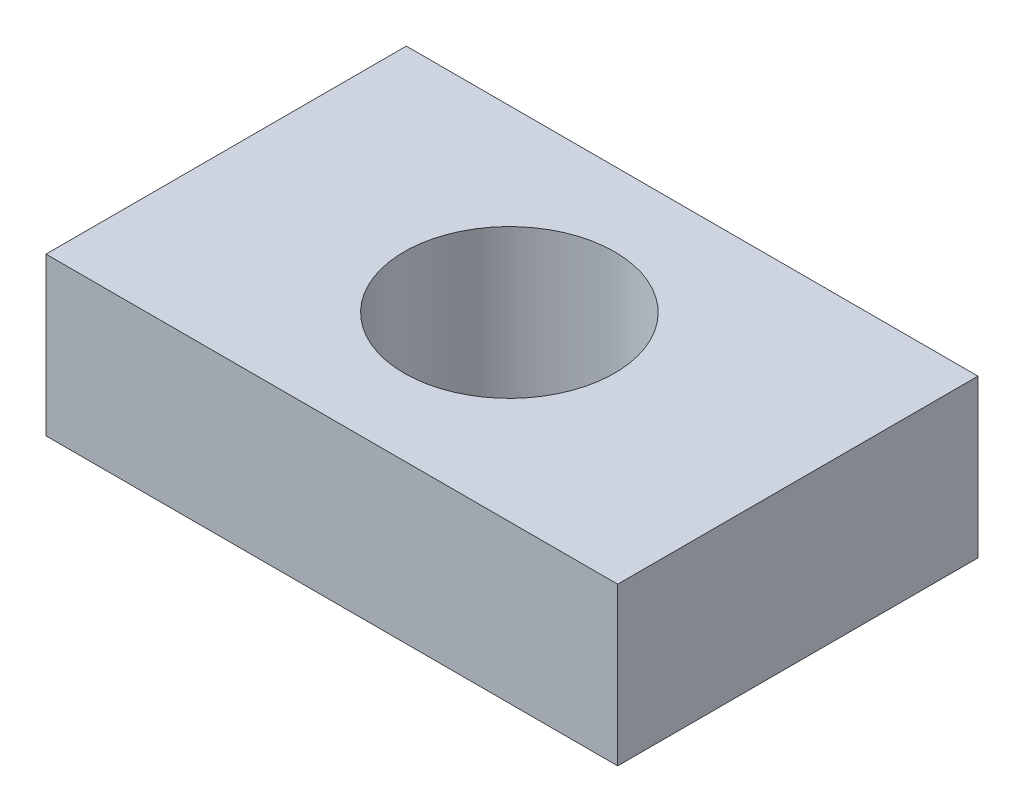
ISO-10303-21;
HEADER;
FILE_DESCRIPTION(('STEP AP214'),'2;1');
FILE_NAME('part.step','',(''),(''),'','','');
FILE_SCHEMA(('AUTOMOTIVE_DESIGN { 1 0 10303 214 1 1 1 1 }'));
ENDSEC;
DATA;
#1=APPLICATION_CONTEXT('core data for automotive mechanical design processes');
#2=APPLICATION_PROTOCOL_DEFINITION('international standard','automotive_design',2000,#1);
#3=PRODUCT_CONTEXT('',#1,'mechanical');
#4=PRODUCT('Part','Part','',(#3));
#5=PRODUCT_RELATED_PRODUCT_CATEGORY('part','',(#4));
#6=PRODUCT_DEFINITION_FORMATION('','',#4);
#7=PRODUCT_DEFINITION_CONTEXT('part definition',#1,'design');
#8=PRODUCT_DEFINITION('design','',#6,#7);
#9=PRODUCT_DEFINITION_SHAPE('','',#8);
#10=(LENGTH_UNIT() NAMED_UNIT(*) SI_UNIT(.MILLI.,.METRE.));
#11=(NAMED_UNIT(*) PLANE_ANGLE_UNIT() SI_UNIT($,.RADIAN.));
#12=(NAMED_UNIT(*) SI_UNIT($,.STERADIAN.) SOLID_ANGLE_UNIT());
#13=UNCERTAINTY_MEASURE_WITH_UNIT(LENGTH_MEASURE(1.E-05),#10,'distance_accuracy_value','');
#14=(GEOMETRIC_REPRESENTATION_CONTEXT(3) GLOBAL_UNCERTAINTY_ASSIGNED_CONTEXT((#13)) GLOBAL_UNIT_ASSIGNED_CONTEXT((#10,
#11,#12)) REPRESENTATION_CONTEXT('',''));
#15=CARTESIAN_POINT('',(0.,0.,0.));
#16=DIRECTION('',(0.,0.,1.));
#17=DIRECTION('',(1.,0.,0.));
#18=AXIS2_PLACEMENT_3D('',#15,#16,#17);
#19=CARTESIAN_POINT('',(0.,43.,0.));
#20=DIRECTION('',(0.,1.,0.));
#21=DIRECTION('',(0.,0.,1.));
#22=AXIS2_PLACEMENT_3D('',#19,#20,#21);
#23=PLANE('',#22);
#24=DIRECTION('',(0.,0.,1.));
#25=VECTOR('',#24,1.);
#26=CARTESIAN_POINT('',(-68.3698875309617,43.,-35.0871856830449));
#27=LINE('',#26,#25);
#28=CARTESIAN_POINT('',(-68.3698875309617,43.,-35.0871856830449));
#29=VERTEX_POINT('',#28);
#30=CARTESIAN_POINT('',(-68.3698875309617,43.,63.3574324333839));
#31=VERTEX_POINT('',#30);
#32=EDGE_CURVE('E98',#29,#31,#27,.T.);
#33=ORIENTED_EDGE('',*,*,#32,.T.);
#34=DIRECTION('',(1.,0.,0.));
#35=VECTOR('',#34,1.);
#36=CARTESIAN_POINT('',(-68.3698875309617,43.,63.3574324333839));
#37=LINE('',#36,#35);
#38=CARTESIAN_POINT('',(87.8182133095638,43.,63.3574324333839));
#39=VERTEX_POINT('',#38);
#40=EDGE_CURVE('E93',#31,#39,#37,.T.);
#41=ORIENTED_EDGE('',*,*,#40,.T.);
#42=DIRECTION('',(0.,0.,-1.));
#43=VECTOR('',#42,1.);
#44=CARTESIAN_POINT('',(87.8182133095638,43.,-35.0871856830449));
#45=LINE('',#44,#43);
#46=CARTESIAN_POINT('',(87.8182133095638,43.,-35.0871856830449));
#47=VERTEX_POINT('',#46);
#48=EDGE_CURVE('E96',#39,#47,#45,.T.);
#49=ORIENTED_EDGE('',*,*,#48,.T.);
#50=DIRECTION('',(-1.,0.,0.));
#51=VECTOR('',#50,1.);
#52=CARTESIAN_POINT('',(-68.3698875309617,43.,-35.0871856830449));
#53=LINE('',#52,#51);
#54=EDGE_CURVE('E63',#47,#29,#53,.T.);
#55=ORIENTED_EDGE('',*,*,#54,.T.);
#56=EDGE_LOOP('',(#33,#41,#49,#55));
#57=FACE_BOUND('',#56,.T.);
#58=CARTESIAN_POINT('',(8.7334995507907,43.,13.8634320657455));
#59=DIRECTION('',(0.,1.,0.));
#60=DIRECTION('',(0.,0.,1.));
#61=AXIS2_PLACEMENT_3D('',#58,#59,#60);
#62=CIRCLE('',#61,28.7473015616817);
#63=CARTESIAN_POINT('',(8.7334995507907,43.,42.6107336274272));
#64=VERTEX_POINT('',#63);
#65=EDGE_CURVE('E118',#64,#64,#62,.T.);
#66=ORIENTED_EDGE('',*,*,#65,.F.);
#67=EDGE_LOOP('',(#66));
#68=FACE_BOUND('',#67,.T.);
#69=ADVANCED_FACE('F45',(#57,#68),#23,.T.);
#70=CARTESIAN_POINT('',(0.,0.,0.));
#71=DIRECTION('',(0.,1.,0.));
#72=DIRECTION('',(0.,0.,1.));
#73=AXIS2_PLACEMENT_3D('',#70,#71,#72);
#74=PLANE('',#73);
#75=DIRECTION('',(0.,0.,1.));
#76=VECTOR('',#75,1.);
#77=CARTESIAN_POINT('',(-68.3698875309617,0.,-35.0871856830449));
#78=LINE('',#77,#76);
#79=CARTESIAN_POINT('',(-68.3698875309617,0.,-35.0871856830449));
#80=VERTEX_POINT('',#79);
#81=CARTESIAN_POINT('',(-68.3698875309617,0.,63.3574324333839));
#82=VERTEX_POINT('',#81);
#83=EDGE_CURVE('E114',#80,#82,#78,.T.);
#84=ORIENTED_EDGE('',*,*,#83,.F.);
#85=DIRECTION('',(-1.,0.,0.));
#86=VECTOR('',#85,1.);
#87=CARTESIAN_POINT('',(-68.3698875309617,0.,-35.0871856830449));
#88=LINE('',#87,#86);
#89=CARTESIAN_POINT('',(87.8182133095638,0.,-35.0871856830449));
#90=VERTEX_POINT('',#89);
#91=EDGE_CURVE('E86',#90,#80,#88,.T.);
#92=ORIENTED_EDGE('',*,*,#91,.F.);
#93=DIRECTION('',(0.,0.,-1.));
#94=VECTOR('',#93,1.);
#95=CARTESIAN_POINT('',(87.8182133095638,0.,-35.0871856830449));
#96=LINE('',#95,#94);
#97=CARTESIAN_POINT('',(87.8182133095638,0.,63.3574324333839));
#98=VERTEX_POINT('',#97);
#99=EDGE_CURVE('E80',#98,#90,#96,.T.);
#100=ORIENTED_EDGE('',*,*,#99,.F.);
#101=DIRECTION('',(1.,0.,0.));
#102=VECTOR('',#101,1.);
#103=CARTESIAN_POINT('',(-68.3698875309617,0.,63.3574324333839));
#104=LINE('',#103,#102);
#105=EDGE_CURVE('E103',#82,#98,#104,.T.);
#106=ORIENTED_EDGE('',*,*,#105,.F.);
#107=EDGE_LOOP('',(#84,#92,#100,#106));
#108=FACE_BOUND('',#107,.T.);
#109=CARTESIAN_POINT('',(8.7334995507907,0.,13.8634320657455));
#110=DIRECTION('',(0.,1.,0.));
#111=DIRECTION('',(0.,0.,1.));
#112=AXIS2_PLACEMENT_3D('',#109,#110,#111);
#113=CIRCLE('',#112,28.7473015616817);
#114=CARTESIAN_POINT('',(8.7334995507907,0.,42.6107336274272));
#115=VERTEX_POINT('',#114);
#116=EDGE_CURVE('E136',#115,#115,#113,.T.);
#117=ORIENTED_EDGE('',*,*,#116,.T.);
#118=EDGE_LOOP('',(#117));
#119=FACE_BOUND('',#118,.T.);
#120=ADVANCED_FACE('F131',(#108,#119),#74,.F.);
#121=CARTESIAN_POINT('',(-68.3698875309617,43.,-35.0871856830449));
#122=DIRECTION('',(1.,0.,0.));
#123=DIRECTION('',(0.,0.,-1.));
#124=AXIS2_PLACEMENT_3D('',#121,#122,#123);
#125=PLANE('',#124);
#126=ORIENTED_EDGE('',*,*,#83,.T.);
#127=DIRECTION('',(0.,-1.,0.));
#128=VECTOR('',#127,1.);
#129=CARTESIAN_POINT('',(-68.3698875309617,43.,63.3574324333839));
#130=LINE('',#129,#128);
#131=EDGE_CURVE('E11',#31,#82,#130,.T.);
#132=ORIENTED_EDGE('',*,*,#131,.F.);
#133=ORIENTED_EDGE('',*,*,#32,.F.);
#134=DIRECTION('',(0.,-1.,0.));
#135=VECTOR('',#134,1.);
#136=CARTESIAN_POINT('',(-68.3698875309617,43.,-35.0871856830449));
#137=LINE('',#136,#135);
#138=EDGE_CURVE('E110',#29,#80,#137,.T.);
#139=ORIENTED_EDGE('',*,*,#138,.T.);
#140=EDGE_LOOP('',(#126,#132,#133,#139));
#141=FACE_BOUND('',#140,.T.);
#142=ADVANCED_FACE('F47',(#141),#125,.F.);
#143=CARTESIAN_POINT('',(-68.3698875309617,43.,63.3574324333839));
#144=DIRECTION('',(0.,0.,-1.));
#145=DIRECTION('',(-1.,0.,0.));
#146=AXIS2_PLACEMENT_3D('',#143,#144,#145);
#147=PLANE('',#146);
#148=ORIENTED_EDGE('',*,*,#105,.T.);
#149=DIRECTION('',(0.,-1.,0.));
#150=VECTOR('',#149,1.);
#151=CARTESIAN_POINT('',(87.8182133095638,43.,63.3574324333839));
#152=LINE('',#151,#150);
#153=EDGE_CURVE('E55',#39,#98,#152,.T.);
#154=ORIENTED_EDGE('',*,*,#153,.F.);
#155=ORIENTED_EDGE('',*,*,#40,.F.);
#156=ORIENTED_EDGE('',*,*,#131,.T.);
#157=EDGE_LOOP('',(#148,#154,#155,#156));
#158=FACE_BOUND('',#157,.T.);
#159=ADVANCED_FACE('F102',(#158),#147,.F.);
#160=CARTESIAN_POINT('',(87.8182133095638,43.,-35.0871856830449));
#161=DIRECTION('',(-1.,0.,0.));
#162=DIRECTION('',(0.,0.,1.));
#163=AXIS2_PLACEMENT_3D('',#160,#161,#162);
#164=PLANE('',#163);
#165=ORIENTED_EDGE('',*,*,#99,.T.);
#166=DIRECTION('',(0.,-1.,0.));
#167=VECTOR('',#166,1.);
#168=CARTESIAN_POINT('',(87.8182133095638,43.,-35.0871856830449));
#169=LINE('',#168,#167);
#170=EDGE_CURVE('E105',#47,#90,#169,.T.);
#171=ORIENTED_EDGE('',*,*,#170,.F.);
#172=ORIENTED_EDGE('',*,*,#48,.F.);
#173=ORIENTED_EDGE('',*,*,#153,.T.);
#174=EDGE_LOOP('',(#165,#171,#172,#173));
#175=FACE_BOUND('',#174,.T.);
#176=ADVANCED_FACE('F106',(#175),#164,.F.);
#177=CARTESIAN_POINT('',(-68.3698875309617,43.,-35.0871856830449));
#178=DIRECTION('',(0.,0.,1.));
#179=DIRECTION('',(1.,0.,0.));
#180=AXIS2_PLACEMENT_3D('',#177,#178,#179);
#181=PLANE('',#180);
#182=ORIENTED_EDGE('',*,*,#91,.T.);
#183=ORIENTED_EDGE('',*,*,#138,.F.);
#184=ORIENTED_EDGE('',*,*,#54,.F.);
#185=ORIENTED_EDGE('',*,*,#170,.T.);
#186=EDGE_LOOP('',(#182,#183,#184,#185));
#187=FACE_BOUND('',#186,.T.);
#188=ADVANCED_FACE('F128',(#187),#181,.F.);
#189=CARTESIAN_POINT('',(8.7334995507907,43.,13.8634320657455));
#190=DIRECTION('',(0.,-1.,0.));
#191=DIRECTION('',(0.,0.,-1.));
#192=AXIS2_PLACEMENT_3D('',#189,#190,#191);
#193=CYLINDRICAL_SURFACE('',#192,28.7473015616817);
#194=ORIENTED_EDGE('',*,*,#65,.T.);
#195=EDGE_LOOP('',(#194));
#196=FACE_BOUND('',#195,.T.);
#197=ORIENTED_EDGE('',*,*,#116,.F.);
#198=EDGE_LOOP('',(#197));
#199=FACE_BOUND('',#198,.T.);
#200=ADVANCED_FACE('F144',(#196,#199),#193,.F.);
#201=CLOSED_SHELL('',(#69,#120,#142,#159,#176,#188,#200));
#202=MANIFOLD_SOLID_BREP('B2',#201);
#203=ADVANCED_BREP_SHAPE_REPRESENTATION('',(#18,#202),#14);
#204=SHAPE_DEFINITION_REPRESENTATION(#9,#203);
ENDSEC;
END-ISO-10303-21;
